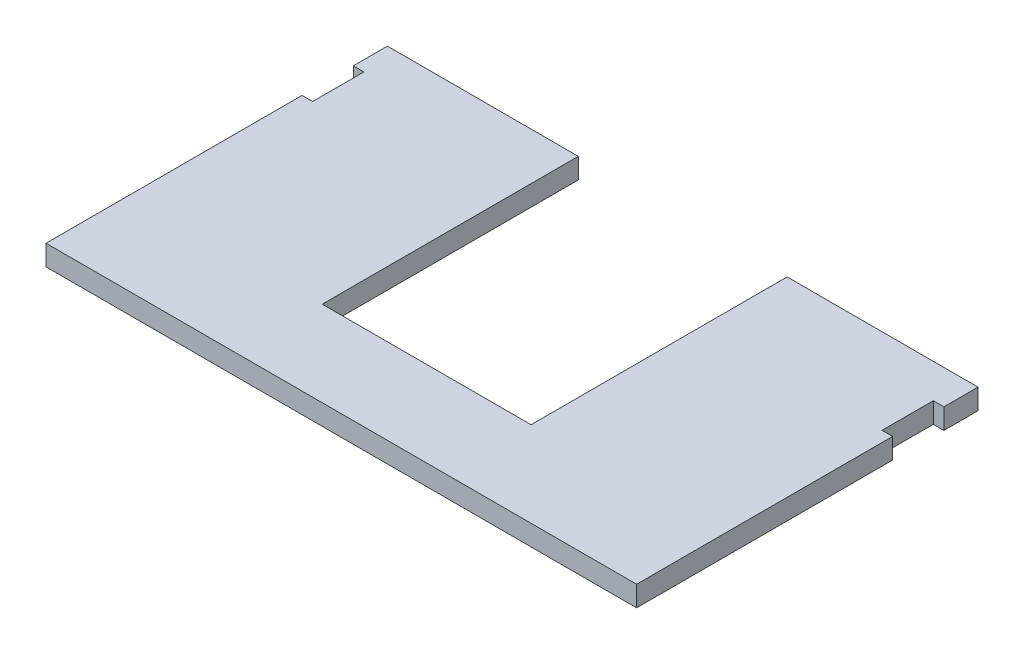
ISO-10303-21;
HEADER;
FILE_DESCRIPTION(('STEP AP214'),'2;1');
FILE_NAME('part.step','',(''),(''),'','','');
FILE_SCHEMA(('AUTOMOTIVE_DESIGN { 1 0 10303 214 1 1 1 1 }'));
ENDSEC;
DATA;
#1=APPLICATION_CONTEXT('core data for automotive mechanical design processes');
#2=APPLICATION_PROTOCOL_DEFINITION('international standard','automotive_design',2000,#1);
#3=PRODUCT_CONTEXT('',#1,'mechanical');
#4=PRODUCT('Part','Part','',(#3));
#5=PRODUCT_RELATED_PRODUCT_CATEGORY('part','',(#4));
#6=PRODUCT_DEFINITION_FORMATION('','',#4);
#7=PRODUCT_DEFINITION_CONTEXT('part definition',#1,'design');
#8=PRODUCT_DEFINITION('design','',#6,#7);
#9=PRODUCT_DEFINITION_SHAPE('','',#8);
#10=(LENGTH_UNIT() NAMED_UNIT(*) SI_UNIT(.MILLI.,.METRE.));
#11=(NAMED_UNIT(*) PLANE_ANGLE_UNIT() SI_UNIT($,.RADIAN.));
#12=(NAMED_UNIT(*) SI_UNIT($,.STERADIAN.) SOLID_ANGLE_UNIT());
#13=UNCERTAINTY_MEASURE_WITH_UNIT(LENGTH_MEASURE(1.E-05),#10,'distance_accuracy_value','');
#14=(GEOMETRIC_REPRESENTATION_CONTEXT(3) GLOBAL_UNCERTAINTY_ASSIGNED_CONTEXT((#13)) GLOBAL_UNIT_ASSIGNED_CONTEXT((#10,
#11,#12)) REPRESENTATION_CONTEXT('',''));
#15=CARTESIAN_POINT('',(0.,0.,0.));
#16=DIRECTION('',(0.,0.,1.));
#17=DIRECTION('',(1.,0.,0.));
#18=AXIS2_PLACEMENT_3D('',#15,#16,#17);
#19=CARTESIAN_POINT('',(0.,6.,0.));
#20=DIRECTION('',(0.,0.,-1.));
#21=DIRECTION('',(-1.,0.,0.));
#22=AXIS2_PLACEMENT_3D('',#19,#20,#21);
#23=PLANE('',#22);
#24=DIRECTION('',(1.,0.,0.));
#25=VECTOR('',#24,1.);
#26=CARTESIAN_POINT('',(0.,0.,0.));
#27=LINE('',#26,#25);
#28=CARTESIAN_POINT('',(0.,0.,0.));
#29=VERTEX_POINT('',#28);
#30=CARTESIAN_POINT('',(173.,0.,0.));
#31=VERTEX_POINT('',#30);
#32=EDGE_CURVE('E185',#29,#31,#27,.T.);
#33=ORIENTED_EDGE('',*,*,#32,.T.);
#34=DIRECTION('',(0.,-1.,0.));
#35=VECTOR('',#34,1.);
#36=CARTESIAN_POINT('',(173.,6.,0.));
#37=LINE('',#36,#35);
#38=CARTESIAN_POINT('',(173.,6.,0.));
#39=VERTEX_POINT('',#38);
#40=EDGE_CURVE('E11',#39,#31,#37,.T.);
#41=ORIENTED_EDGE('',*,*,#40,.F.);
#42=DIRECTION('',(1.,0.,0.));
#43=VECTOR('',#42,1.);
#44=CARTESIAN_POINT('',(0.,6.,0.));
#45=LINE('',#44,#43);
#46=CARTESIAN_POINT('',(0.,6.,0.));
#47=VERTEX_POINT('',#46);
#48=EDGE_CURVE('E317',#47,#39,#45,.T.);
#49=ORIENTED_EDGE('',*,*,#48,.F.);
#50=DIRECTION('',(0.,-1.,0.));
#51=VECTOR('',#50,1.);
#52=CARTESIAN_POINT('',(0.,6.,0.));
#53=LINE('',#52,#51);
#54=EDGE_CURVE('E54',#47,#29,#53,.T.);
#55=ORIENTED_EDGE('',*,*,#54,.T.);
#56=EDGE_LOOP('',(#33,#41,#49,#55));
#57=FACE_BOUND('',#56,.T.);
#58=ADVANCED_FACE('F38',(#57),#23,.F.);
#59=CARTESIAN_POINT('',(173.,6.,0.));
#60=DIRECTION('',(-1.,0.,0.));
#61=DIRECTION('',(0.,0.,1.));
#62=AXIS2_PLACEMENT_3D('',#59,#60,#61);
#63=PLANE('',#62);
#64=DIRECTION('',(0.,0.,-1.));
#65=VECTOR('',#64,1.);
#66=CARTESIAN_POINT('',(173.,0.,0.));
#67=LINE('',#66,#65);
#68=CARTESIAN_POINT('',(173.,0.,-75.));
#69=VERTEX_POINT('',#68);
#70=EDGE_CURVE('E187',#31,#69,#67,.T.);
#71=ORIENTED_EDGE('',*,*,#70,.T.);
#72=DIRECTION('',(0.,-1.,0.));
#73=VECTOR('',#72,1.);
#74=CARTESIAN_POINT('',(173.,6.,-75.));
#75=LINE('',#74,#73);
#76=CARTESIAN_POINT('',(173.,6.,-75.));
#77=VERTEX_POINT('',#76);
#78=EDGE_CURVE('E46',#77,#69,#75,.T.);
#79=ORIENTED_EDGE('',*,*,#78,.F.);
#80=DIRECTION('',(0.,0.,-1.));
#81=VECTOR('',#80,1.);
#82=CARTESIAN_POINT('',(173.,6.,0.));
#83=LINE('',#82,#81);
#84=EDGE_CURVE('E116',#39,#77,#83,.T.);
#85=ORIENTED_EDGE('',*,*,#84,.F.);
#86=ORIENTED_EDGE('',*,*,#40,.T.);
#87=EDGE_LOOP('',(#71,#79,#85,#86));
#88=FACE_BOUND('',#87,.T.);
#89=ADVANCED_FACE('F309',(#88),#63,.F.);
#90=CARTESIAN_POINT('',(0.,6.,-75.));
#91=DIRECTION('',(0.,0.,1.));
#92=DIRECTION('',(1.,0.,0.));
#93=AXIS2_PLACEMENT_3D('',#90,#91,#92);
#94=PLANE('',#93);
#95=DIRECTION('',(-1.,0.,0.));
#96=VECTOR('',#95,1.);
#97=CARTESIAN_POINT('',(0.,0.,-75.));
#98=LINE('',#97,#96);
#99=CARTESIAN_POINT('',(169.9,0.,-75.));
#100=VERTEX_POINT('',#99);
#101=EDGE_CURVE('E189',#69,#100,#98,.T.);
#102=ORIENTED_EDGE('',*,*,#101,.T.);
#103=DIRECTION('',(0.,-1.,0.));
#104=VECTOR('',#103,1.);
#105=CARTESIAN_POINT('',(169.9,6.,-75.));
#106=LINE('',#105,#104);
#107=CARTESIAN_POINT('',(169.9,6.,-75.));
#108=VERTEX_POINT('',#107);
#109=EDGE_CURVE('E244',#108,#100,#106,.T.);
#110=ORIENTED_EDGE('',*,*,#109,.F.);
#111=DIRECTION('',(-1.,0.,0.));
#112=VECTOR('',#111,1.);
#113=CARTESIAN_POINT('',(0.,6.,-75.));
#114=LINE('',#113,#112);
#115=EDGE_CURVE('E251',#77,#108,#114,.T.);
#116=ORIENTED_EDGE('',*,*,#115,.F.);
#117=ORIENTED_EDGE('',*,*,#78,.T.);
#118=EDGE_LOOP('',(#102,#110,#116,#117));
#119=FACE_BOUND('',#118,.T.);
#120=ADVANCED_FACE('F249',(#119),#94,.F.);
#121=CARTESIAN_POINT('',(169.9,6.,0.));
#122=DIRECTION('',(1.,0.,0.));
#123=DIRECTION('',(0.,0.,-1.));
#124=AXIS2_PLACEMENT_3D('',#121,#122,#123);
#125=PLANE('',#124);
#126=DIRECTION('',(0.,0.,1.));
#127=VECTOR('',#126,1.);
#128=CARTESIAN_POINT('',(169.9,0.,0.));
#129=LINE('',#128,#127);
#130=CARTESIAN_POINT('',(169.9,0.,-90.));
#131=VERTEX_POINT('',#130);
#132=EDGE_CURVE('E193',#131,#100,#129,.T.);
#133=ORIENTED_EDGE('',*,*,#132,.F.);
#134=DIRECTION('',(0.,-1.,0.));
#135=VECTOR('',#134,1.);
#136=CARTESIAN_POINT('',(169.9,6.,-90.));
#137=LINE('',#136,#135);
#138=CARTESIAN_POINT('',(169.9,6.,-90.));
#139=VERTEX_POINT('',#138);
#140=EDGE_CURVE('E242',#139,#131,#137,.T.);
#141=ORIENTED_EDGE('',*,*,#140,.F.);
#142=DIRECTION('',(0.,0.,1.));
#143=VECTOR('',#142,1.);
#144=CARTESIAN_POINT('',(169.9,6.,0.));
#145=LINE('',#144,#143);
#146=EDGE_CURVE('E261',#139,#108,#145,.T.);
#147=ORIENTED_EDGE('',*,*,#146,.T.);
#148=ORIENTED_EDGE('',*,*,#109,.T.);
#149=EDGE_LOOP('',(#133,#141,#147,#148));
#150=FACE_BOUND('',#149,.T.);
#151=ADVANCED_FACE('F258',(#150),#125,.T.);
#152=CARTESIAN_POINT('',(0.,6.,-90.));
#153=DIRECTION('',(0.,0.,1.));
#154=DIRECTION('',(1.,0.,0.));
#155=AXIS2_PLACEMENT_3D('',#152,#153,#154);
#156=PLANE('',#155);
#157=DIRECTION('',(-1.,0.,0.));
#158=VECTOR('',#157,1.);
#159=CARTESIAN_POINT('',(0.,0.,-90.));
#160=LINE('',#159,#158);
#161=CARTESIAN_POINT('',(173.,0.,-90.));
#162=VERTEX_POINT('',#161);
#163=EDGE_CURVE('E196',#162,#131,#160,.T.);
#164=ORIENTED_EDGE('',*,*,#163,.F.);
#165=DIRECTION('',(0.,-1.,0.));
#166=VECTOR('',#165,1.);
#167=CARTESIAN_POINT('',(173.,6.,-90.));
#168=LINE('',#167,#166);
#169=CARTESIAN_POINT('',(173.,6.,-90.));
#170=VERTEX_POINT('',#169);
#171=EDGE_CURVE('E240',#170,#162,#168,.T.);
#172=ORIENTED_EDGE('',*,*,#171,.F.);
#173=DIRECTION('',(-1.,0.,0.));
#174=VECTOR('',#173,1.);
#175=CARTESIAN_POINT('',(0.,6.,-90.));
#176=LINE('',#175,#174);
#177=EDGE_CURVE('E264',#170,#139,#176,.T.);
#178=ORIENTED_EDGE('',*,*,#177,.T.);
#179=ORIENTED_EDGE('',*,*,#140,.T.);
#180=EDGE_LOOP('',(#164,#172,#178,#179));
#181=FACE_BOUND('',#180,.T.);
#182=ADVANCED_FACE('F349',(#181),#156,.T.);
#183=CARTESIAN_POINT('',(173.,0.,-100.));
#184=VERTEX_POINT('',#183);
#185=EDGE_CURVE('E190',#162,#184,#67,.T.);
#186=ORIENTED_EDGE('',*,*,#185,.T.);
#187=DIRECTION('',(0.,-1.,0.));
#188=VECTOR('',#187,1.);
#189=CARTESIAN_POINT('',(173.,6.,-100.));
#190=LINE('',#189,#188);
#191=CARTESIAN_POINT('',(173.,6.,-100.));
#192=VERTEX_POINT('',#191);
#193=EDGE_CURVE('E238',#192,#184,#190,.T.);
#194=ORIENTED_EDGE('',*,*,#193,.F.);
#195=EDGE_CURVE('E266',#170,#192,#83,.T.);
#196=ORIENTED_EDGE('',*,*,#195,.F.);
#197=ORIENTED_EDGE('',*,*,#171,.T.);
#198=EDGE_LOOP('',(#186,#194,#196,#197));
#199=FACE_BOUND('',#198,.T.);
#200=ADVANCED_FACE('F314',(#199),#63,.F.);
#201=CARTESIAN_POINT('',(0.,6.,-100.));
#202=DIRECTION('',(0.,0.,-1.));
#203=DIRECTION('',(-1.,0.,0.));
#204=AXIS2_PLACEMENT_3D('',#201,#202,#203);
#205=PLANE('',#204);
#206=DIRECTION('',(1.,0.,0.));
#207=VECTOR('',#206,1.);
#208=CARTESIAN_POINT('',(0.,0.,-100.));
#209=LINE('',#208,#207);
#210=CARTESIAN_POINT('',(117.085,0.,-100.));
#211=VERTEX_POINT('',#210);
#212=EDGE_CURVE('E199',#211,#184,#209,.T.);
#213=ORIENTED_EDGE('',*,*,#212,.F.);
#214=DIRECTION('',(0.,-1.,0.));
#215=VECTOR('',#214,1.);
#216=CARTESIAN_POINT('',(117.085,6.,-100.));
#217=LINE('',#216,#215);
#218=CARTESIAN_POINT('',(117.085,6.,-100.));
#219=VERTEX_POINT('',#218);
#220=EDGE_CURVE('E236',#219,#211,#217,.T.);
#221=ORIENTED_EDGE('',*,*,#220,.F.);
#222=DIRECTION('',(1.,0.,0.));
#223=VECTOR('',#222,1.);
#224=CARTESIAN_POINT('',(0.,6.,-100.));
#225=LINE('',#224,#223);
#226=EDGE_CURVE('E271',#219,#192,#225,.T.);
#227=ORIENTED_EDGE('',*,*,#226,.T.);
#228=ORIENTED_EDGE('',*,*,#193,.T.);
#229=EDGE_LOOP('',(#213,#221,#227,#228));
#230=FACE_BOUND('',#229,.T.);
#231=ADVANCED_FACE('F326',(#230),#205,.T.);
#232=CARTESIAN_POINT('',(117.085,6.,0.));
#233=DIRECTION('',(1.,0.,0.));
#234=DIRECTION('',(0.,0.,-1.));
#235=AXIS2_PLACEMENT_3D('',#232,#233,#234);
#236=PLANE('',#235);
#237=DIRECTION('',(0.,0.,1.));
#238=VECTOR('',#237,1.);
#239=CARTESIAN_POINT('',(117.085,0.,0.));
#240=LINE('',#239,#238);
#241=CARTESIAN_POINT('',(117.085,0.,-25.));
#242=VERTEX_POINT('',#241);
#243=EDGE_CURVE('E202',#211,#242,#240,.T.);
#244=ORIENTED_EDGE('',*,*,#243,.T.);
#245=DIRECTION('',(0.,-1.,0.));
#246=VECTOR('',#245,1.);
#247=CARTESIAN_POINT('',(117.085,6.,-25.));
#248=LINE('',#247,#246);
#249=CARTESIAN_POINT('',(117.085,6.,-25.));
#250=VERTEX_POINT('',#249);
#251=EDGE_CURVE('E234',#250,#242,#248,.T.);
#252=ORIENTED_EDGE('',*,*,#251,.F.);
#253=DIRECTION('',(0.,0.,1.));
#254=VECTOR('',#253,1.);
#255=CARTESIAN_POINT('',(117.085,6.,0.));
#256=LINE('',#255,#254);
#257=EDGE_CURVE('E274',#219,#250,#256,.T.);
#258=ORIENTED_EDGE('',*,*,#257,.F.);
#259=ORIENTED_EDGE('',*,*,#220,.T.);
#260=EDGE_LOOP('',(#244,#252,#258,#259));
#261=FACE_BOUND('',#260,.T.);
#262=ADVANCED_FACE('F331',(#261),#236,.F.);
#263=CARTESIAN_POINT('',(0.,6.,-25.));
#264=DIRECTION('',(0.,0.,-1.));
#265=DIRECTION('',(-1.,0.,0.));
#266=AXIS2_PLACEMENT_3D('',#263,#264,#265);
#267=PLANE('',#266);
#268=DIRECTION('',(1.,0.,0.));
#269=VECTOR('',#268,1.);
#270=CARTESIAN_POINT('',(0.,0.,-25.));
#271=LINE('',#270,#269);
#272=CARTESIAN_POINT('',(55.915,0.,-25.));
#273=VERTEX_POINT('',#272);
#274=EDGE_CURVE('E205',#273,#242,#271,.T.);
#275=ORIENTED_EDGE('',*,*,#274,.F.);
#276=DIRECTION('',(0.,-1.,0.));
#277=VECTOR('',#276,1.);
#278=CARTESIAN_POINT('',(55.915,6.,-25.));
#279=LINE('',#278,#277);
#280=CARTESIAN_POINT('',(55.915,6.,-25.));
#281=VERTEX_POINT('',#280);
#282=EDGE_CURVE('E232',#281,#273,#279,.T.);
#283=ORIENTED_EDGE('',*,*,#282,.F.);
#284=DIRECTION('',(1.,0.,0.));
#285=VECTOR('',#284,1.);
#286=CARTESIAN_POINT('',(0.,6.,-25.));
#287=LINE('',#286,#285);
#288=EDGE_CURVE('E276',#281,#250,#287,.T.);
#289=ORIENTED_EDGE('',*,*,#288,.T.);
#290=ORIENTED_EDGE('',*,*,#251,.T.);
#291=EDGE_LOOP('',(#275,#283,#289,#290));
#292=FACE_BOUND('',#291,.T.);
#293=ADVANCED_FACE('F336',(#292),#267,.T.);
#294=CARTESIAN_POINT('',(55.915,6.,0.));
#295=DIRECTION('',(1.,0.,0.));
#296=DIRECTION('',(0.,0.,-1.));
#297=AXIS2_PLACEMENT_3D('',#294,#295,#296);
#298=PLANE('',#297);
#299=DIRECTION('',(0.,0.,1.));
#300=VECTOR('',#299,1.);
#301=CARTESIAN_POINT('',(55.915,0.,0.));
#302=LINE('',#301,#300);
#303=CARTESIAN_POINT('',(55.915,0.,-100.));
#304=VERTEX_POINT('',#303);
#305=EDGE_CURVE('E208',#304,#273,#302,.T.);
#306=ORIENTED_EDGE('',*,*,#305,.F.);
#307=DIRECTION('',(0.,-1.,0.));
#308=VECTOR('',#307,1.);
#309=CARTESIAN_POINT('',(55.915,6.,-100.));
#310=LINE('',#309,#308);
#311=CARTESIAN_POINT('',(55.915,6.,-100.));
#312=VERTEX_POINT('',#311);
#313=EDGE_CURVE('E230',#312,#304,#310,.T.);
#314=ORIENTED_EDGE('',*,*,#313,.F.);
#315=DIRECTION('',(0.,0.,1.));
#316=VECTOR('',#315,1.);
#317=CARTESIAN_POINT('',(55.915,6.,0.));
#318=LINE('',#317,#316);
#319=EDGE_CURVE('E279',#312,#281,#318,.T.);
#320=ORIENTED_EDGE('',*,*,#319,.T.);
#321=ORIENTED_EDGE('',*,*,#282,.T.);
#322=EDGE_LOOP('',(#306,#314,#320,#321));
#323=FACE_BOUND('',#322,.T.);
#324=ADVANCED_FACE('F334',(#323),#298,.T.);
#325=CARTESIAN_POINT('',(0.,6.,-100.));
#326=DIRECTION('',(0.,0.,-1.));
#327=DIRECTION('',(-1.,0.,0.));
#328=AXIS2_PLACEMENT_3D('',#325,#326,#327);
#329=PLANE('',#328);
#330=DIRECTION('',(1.,0.,0.));
#331=VECTOR('',#330,1.);
#332=CARTESIAN_POINT('',(0.,0.,-100.));
#333=LINE('',#332,#331);
#334=CARTESIAN_POINT('',(0.,0.,-100.));
#335=VERTEX_POINT('',#334);
#336=EDGE_CURVE('E211',#335,#304,#333,.T.);
#337=ORIENTED_EDGE('',*,*,#336,.F.);
#338=DIRECTION('',(0.,-1.,0.));
#339=VECTOR('',#338,1.);
#340=CARTESIAN_POINT('',(0.,6.,-100.));
#341=LINE('',#340,#339);
#342=CARTESIAN_POINT('',(0.,6.,-100.));
#343=VERTEX_POINT('',#342);
#344=EDGE_CURVE('E228',#343,#335,#341,.T.);
#345=ORIENTED_EDGE('',*,*,#344,.F.);
#346=DIRECTION('',(1.,0.,0.));
#347=VECTOR('',#346,1.);
#348=CARTESIAN_POINT('',(0.,6.,-100.));
#349=LINE('',#348,#347);
#350=EDGE_CURVE('E282',#343,#312,#349,.T.);
#351=ORIENTED_EDGE('',*,*,#350,.T.);
#352=ORIENTED_EDGE('',*,*,#313,.T.);
#353=EDGE_LOOP('',(#337,#345,#351,#352));
#354=FACE_BOUND('',#353,.T.);
#355=ADVANCED_FACE('F293',(#354),#329,.T.);
#356=CARTESIAN_POINT('',(0.,6.,0.));
#357=DIRECTION('',(-1.,0.,0.));
#358=DIRECTION('',(0.,0.,1.));
#359=AXIS2_PLACEMENT_3D('',#356,#357,#358);
#360=PLANE('',#359);
#361=DIRECTION('',(0.,0.,-1.));
#362=VECTOR('',#361,1.);
#363=CARTESIAN_POINT('',(0.,0.,0.));
#364=LINE('',#363,#362);
#365=CARTESIAN_POINT('',(0.,0.,-90.));
#366=VERTEX_POINT('',#365);
#367=EDGE_CURVE('E214',#366,#335,#364,.T.);
#368=ORIENTED_EDGE('',*,*,#367,.F.);
#369=DIRECTION('',(0.,-1.,0.));
#370=VECTOR('',#369,1.);
#371=CARTESIAN_POINT('',(0.,6.,-90.));
#372=LINE('',#371,#370);
#373=CARTESIAN_POINT('',(0.,6.,-90.));
#374=VERTEX_POINT('',#373);
#375=EDGE_CURVE('E226',#374,#366,#372,.T.);
#376=ORIENTED_EDGE('',*,*,#375,.F.);
#377=DIRECTION('',(0.,0.,-1.));
#378=VECTOR('',#377,1.);
#379=CARTESIAN_POINT('',(0.,6.,0.));
#380=LINE('',#379,#378);
#381=EDGE_CURVE('E182',#374,#343,#380,.T.);
#382=ORIENTED_EDGE('',*,*,#381,.T.);
#383=ORIENTED_EDGE('',*,*,#344,.T.);
#384=EDGE_LOOP('',(#368,#376,#382,#383));
#385=FACE_BOUND('',#384,.T.);
#386=ADVANCED_FACE('F287',(#385),#360,.T.);
#387=CARTESIAN_POINT('',(0.,6.,-90.));
#388=DIRECTION('',(0.,0.,-1.));
#389=DIRECTION('',(-1.,0.,0.));
#390=AXIS2_PLACEMENT_3D('',#387,#388,#389);
#391=PLANE('',#390);
#392=DIRECTION('',(1.,0.,0.));
#393=VECTOR('',#392,1.);
#394=CARTESIAN_POINT('',(0.,0.,-90.));
#395=LINE('',#394,#393);
#396=CARTESIAN_POINT('',(3.1,0.,-90.));
#397=VERTEX_POINT('',#396);
#398=EDGE_CURVE('E217',#366,#397,#395,.T.);
#399=ORIENTED_EDGE('',*,*,#398,.T.);
#400=DIRECTION('',(0.,-1.,0.));
#401=VECTOR('',#400,1.);
#402=CARTESIAN_POINT('',(3.1,6.,-90.));
#403=LINE('',#402,#401);
#404=CARTESIAN_POINT('',(3.1,6.,-90.));
#405=VERTEX_POINT('',#404);
#406=EDGE_CURVE('E176',#405,#397,#403,.T.);
#407=ORIENTED_EDGE('',*,*,#406,.F.);
#408=DIRECTION('',(1.,0.,0.));
#409=VECTOR('',#408,1.);
#410=CARTESIAN_POINT('',(0.,6.,-90.));
#411=LINE('',#410,#409);
#412=EDGE_CURVE('E164',#374,#405,#411,.T.);
#413=ORIENTED_EDGE('',*,*,#412,.F.);
#414=ORIENTED_EDGE('',*,*,#375,.T.);
#415=EDGE_LOOP('',(#399,#407,#413,#414));
#416=FACE_BOUND('',#415,.T.);
#417=ADVANCED_FACE('F297',(#416),#391,.F.);
#418=CARTESIAN_POINT('',(3.1,6.,0.));
#419=DIRECTION('',(1.,0.,0.));
#420=DIRECTION('',(0.,0.,-1.));
#421=AXIS2_PLACEMENT_3D('',#418,#419,#420);
#422=PLANE('',#421);
#423=DIRECTION('',(0.,0.,1.));
#424=VECTOR('',#423,1.);
#425=CARTESIAN_POINT('',(3.1,0.,0.));
#426=LINE('',#425,#424);
#427=CARTESIAN_POINT('',(3.1,0.,-75.));
#428=VERTEX_POINT('',#427);
#429=EDGE_CURVE('E173',#397,#428,#426,.T.);
#430=ORIENTED_EDGE('',*,*,#429,.T.);
#431=DIRECTION('',(0.,-1.,0.));
#432=VECTOR('',#431,1.);
#433=CARTESIAN_POINT('',(3.1,6.,-75.));
#434=LINE('',#433,#432);
#435=CARTESIAN_POINT('',(3.1,6.,-75.));
#436=VERTEX_POINT('',#435);
#437=EDGE_CURVE('E170',#436,#428,#434,.T.);
#438=ORIENTED_EDGE('',*,*,#437,.F.);
#439=DIRECTION('',(0.,0.,1.));
#440=VECTOR('',#439,1.);
#441=CARTESIAN_POINT('',(3.1,6.,0.));
#442=LINE('',#441,#440);
#443=EDGE_CURVE('E156',#405,#436,#442,.T.);
#444=ORIENTED_EDGE('',*,*,#443,.F.);
#445=ORIENTED_EDGE('',*,*,#406,.T.);
#446=EDGE_LOOP('',(#430,#438,#444,#445));
#447=FACE_BOUND('',#446,.T.);
#448=ADVANCED_FACE('F171',(#447),#422,.F.);
#449=CARTESIAN_POINT('',(0.,6.,-75.));
#450=DIRECTION('',(0.,0.,-1.));
#451=DIRECTION('',(-1.,0.,0.));
#452=AXIS2_PLACEMENT_3D('',#449,#450,#451);
#453=PLANE('',#452);
#454=DIRECTION('',(1.,0.,0.));
#455=VECTOR('',#454,1.);
#456=CARTESIAN_POINT('',(0.,0.,-75.));
#457=LINE('',#456,#455);
#458=CARTESIAN_POINT('',(0.,0.,-75.));
#459=VERTEX_POINT('',#458);
#460=EDGE_CURVE('E221',#459,#428,#457,.T.);
#461=ORIENTED_EDGE('',*,*,#460,.F.);
#462=DIRECTION('',(0.,-1.,0.));
#463=VECTOR('',#462,1.);
#464=CARTESIAN_POINT('',(0.,6.,-75.));
#465=LINE('',#464,#463);
#466=CARTESIAN_POINT('',(0.,6.,-75.));
#467=VERTEX_POINT('',#466);
#468=EDGE_CURVE('E104',#467,#459,#465,.T.);
#469=ORIENTED_EDGE('',*,*,#468,.F.);
#470=DIRECTION('',(1.,0.,0.));
#471=VECTOR('',#470,1.);
#472=CARTESIAN_POINT('',(0.,6.,-75.));
#473=LINE('',#472,#471);
#474=EDGE_CURVE('E161',#467,#436,#473,.T.);
#475=ORIENTED_EDGE('',*,*,#474,.T.);
#476=ORIENTED_EDGE('',*,*,#437,.T.);
#477=EDGE_LOOP('',(#461,#469,#475,#476));
#478=FACE_BOUND('',#477,.T.);
#479=ADVANCED_FACE('F178',(#478),#453,.T.);
#480=EDGE_CURVE('E218',#29,#459,#364,.T.);
#481=ORIENTED_EDGE('',*,*,#480,.F.);
#482=ORIENTED_EDGE('',*,*,#54,.F.);
#483=EDGE_CURVE('E179',#47,#467,#380,.T.);
#484=ORIENTED_EDGE('',*,*,#483,.T.);
#485=ORIENTED_EDGE('',*,*,#468,.T.);
#486=EDGE_LOOP('',(#481,#482,#484,#485));
#487=FACE_BOUND('',#486,.T.);
#488=ADVANCED_FACE('F306',(#487),#360,.T.);
#489=CARTESIAN_POINT('',(0.,6.,0.));
#490=DIRECTION('',(0.,1.,0.));
#491=DIRECTION('',(0.,0.,1.));
#492=AXIS2_PLACEMENT_3D('',#489,#490,#491);
#493=PLANE('',#492);
#494=ORIENTED_EDGE('',*,*,#48,.T.);
#495=ORIENTED_EDGE('',*,*,#84,.T.);
#496=ORIENTED_EDGE('',*,*,#115,.T.);
#497=ORIENTED_EDGE('',*,*,#146,.F.);
#498=ORIENTED_EDGE('',*,*,#177,.F.);
#499=ORIENTED_EDGE('',*,*,#195,.T.);
#500=ORIENTED_EDGE('',*,*,#226,.F.);
#501=ORIENTED_EDGE('',*,*,#257,.T.);
#502=ORIENTED_EDGE('',*,*,#288,.F.);
#503=ORIENTED_EDGE('',*,*,#319,.F.);
#504=ORIENTED_EDGE('',*,*,#350,.F.);
#505=ORIENTED_EDGE('',*,*,#381,.F.);
#506=ORIENTED_EDGE('',*,*,#412,.T.);
#507=ORIENTED_EDGE('',*,*,#443,.T.);
#508=ORIENTED_EDGE('',*,*,#474,.F.);
#509=ORIENTED_EDGE('',*,*,#483,.F.);
#510=EDGE_LOOP('',(#494,#495,#496,#497,#498,#499,#500,#501,#502,#503,#504,#505,#506,#507,#508,#509));
#511=FACE_BOUND('',#510,.T.);
#512=ADVANCED_FACE('F158',(#511),#493,.T.);
#513=CARTESIAN_POINT('',(0.,0.,0.));
#514=DIRECTION('',(0.,1.,0.));
#515=DIRECTION('',(0.,0.,1.));
#516=AXIS2_PLACEMENT_3D('',#513,#514,#515);
#517=PLANE('',#516);
#518=ORIENTED_EDGE('',*,*,#32,.F.);
#519=ORIENTED_EDGE('',*,*,#480,.T.);
#520=ORIENTED_EDGE('',*,*,#460,.T.);
#521=ORIENTED_EDGE('',*,*,#429,.F.);
#522=ORIENTED_EDGE('',*,*,#398,.F.);
#523=ORIENTED_EDGE('',*,*,#367,.T.);
#524=ORIENTED_EDGE('',*,*,#336,.T.);
#525=ORIENTED_EDGE('',*,*,#305,.T.);
#526=ORIENTED_EDGE('',*,*,#274,.T.);
#527=ORIENTED_EDGE('',*,*,#243,.F.);
#528=ORIENTED_EDGE('',*,*,#212,.T.);
#529=ORIENTED_EDGE('',*,*,#185,.F.);
#530=ORIENTED_EDGE('',*,*,#163,.T.);
#531=ORIENTED_EDGE('',*,*,#132,.T.);
#532=ORIENTED_EDGE('',*,*,#101,.F.);
#533=ORIENTED_EDGE('',*,*,#70,.F.);
#534=EDGE_LOOP('',(#518,#519,#520,#521,#522,#523,#524,#525,#526,#527,#528,#529,#530,#531,#532,#533));
#535=FACE_BOUND('',#534,.T.);
#536=ADVANCED_FACE('F253',(#535),#517,.F.);
#537=CLOSED_SHELL('',(#58,#89,#120,#151,#182,#200,#231,#262,#293,#324,#355,#386,#417,#448,#479,
#488,#512,#536));
#538=MANIFOLD_SOLID_BREP('B2',#537);
#539=ADVANCED_BREP_SHAPE_REPRESENTATION('',(#18,#538),#14);
#540=SHAPE_DEFINITION_REPRESENTATION(#9,#539);
ENDSEC;
END-ISO-10303-21;
